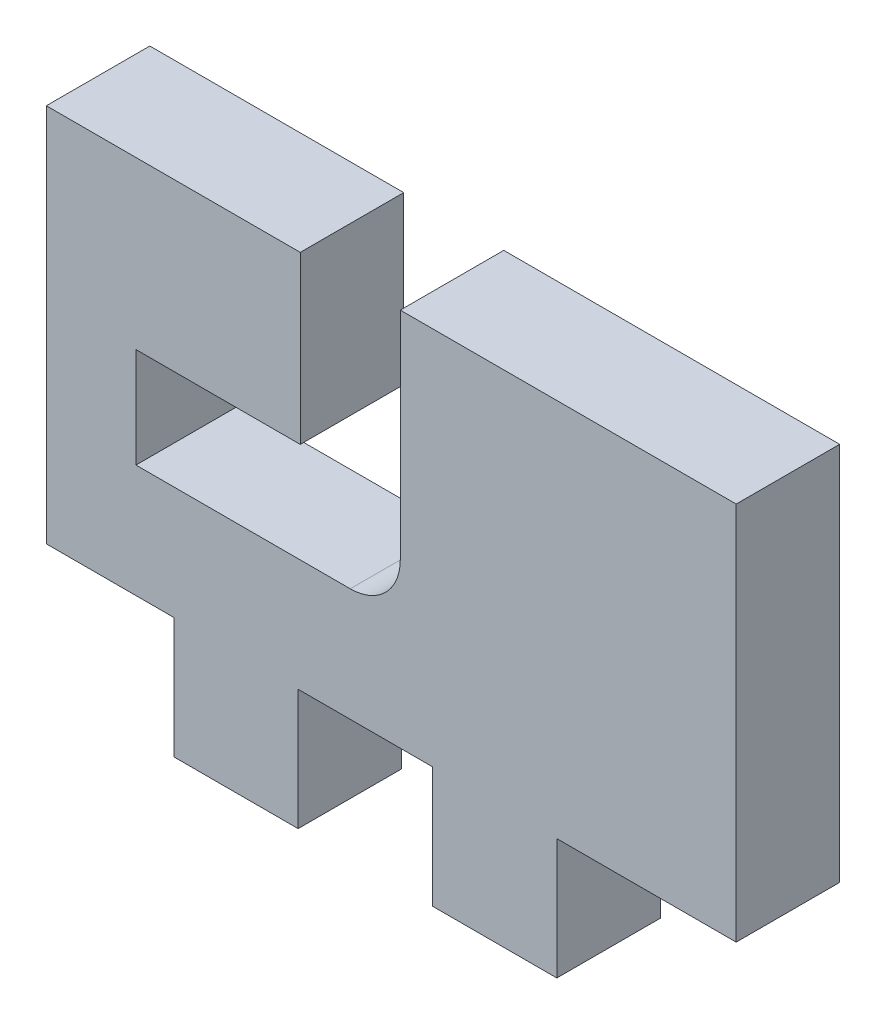
ISO-10303-21;
HEADER;
FILE_DESCRIPTION(('STEP AP214'),'2;1');
FILE_NAME('part.step','',(''),(''),'','','');
FILE_SCHEMA(('AUTOMOTIVE_DESIGN { 1 0 10303 214 1 1 1 1 }'));
ENDSEC;
DATA;
#1=APPLICATION_CONTEXT('core data for automotive mechanical design processes');
#2=APPLICATION_PROTOCOL_DEFINITION('international standard','automotive_design',2000,#1);
#3=PRODUCT_CONTEXT('',#1,'mechanical');
#4=PRODUCT('Part','Part','',(#3));
#5=PRODUCT_RELATED_PRODUCT_CATEGORY('part','',(#4));
#6=PRODUCT_DEFINITION_FORMATION('','',#4);
#7=PRODUCT_DEFINITION_CONTEXT('part definition',#1,'design');
#8=PRODUCT_DEFINITION('design','',#6,#7);
#9=PRODUCT_DEFINITION_SHAPE('','',#8);
#10=(LENGTH_UNIT() NAMED_UNIT(*) SI_UNIT(.MILLI.,.METRE.));
#11=(NAMED_UNIT(*) PLANE_ANGLE_UNIT() SI_UNIT($,.RADIAN.));
#12=(NAMED_UNIT(*) SI_UNIT($,.STERADIAN.) SOLID_ANGLE_UNIT());
#13=UNCERTAINTY_MEASURE_WITH_UNIT(LENGTH_MEASURE(1.E-05),#10,'distance_accuracy_value','');
#14=(GEOMETRIC_REPRESENTATION_CONTEXT(3) GLOBAL_UNCERTAINTY_ASSIGNED_CONTEXT((#13)) GLOBAL_UNIT_ASSIGNED_CONTEXT((#10,
#11,#12)) REPRESENTATION_CONTEXT('',''));
#15=CARTESIAN_POINT('',(0.,0.,0.));
#16=DIRECTION('',(0.,0.,1.));
#17=DIRECTION('',(1.,0.,0.));
#18=AXIS2_PLACEMENT_3D('',#15,#16,#17);
#19=CARTESIAN_POINT('',(0.927974825237484,-1.93817914495574,0.));
#20=DIRECTION('',(0.,0.,1.));
#21=DIRECTION('',(1.,0.,0.));
#22=AXIS2_PLACEMENT_3D('',#19,#20,#21);
#23=CYLINDRICAL_SURFACE('',#22,1.45);
#24=DIRECTION('',(0.,0.,1.));
#25=VECTOR('',#24,1.);
#26=CARTESIAN_POINT('',(0.927974825237484,-3.38817914495575,0.));
#27=LINE('',#26,#25);
#28=CARTESIAN_POINT('',(0.927974825237484,-3.38817914495575,3.));
#29=VERTEX_POINT('',#28);
#30=CARTESIAN_POINT('',(0.927974825237484,-3.38817914495575,0.));
#31=VERTEX_POINT('',#30);
#32=EDGE_CURVE('E47',#29,#31,#27,.F.);
#33=ORIENTED_EDGE('',*,*,#32,.F.);
#34=CARTESIAN_POINT('',(0.927974825237484,-1.93817914495574,3.));
#35=DIRECTION('',(0.,0.,1.));
#36=DIRECTION('',(1.,0.,0.));
#37=AXIS2_PLACEMENT_3D('',#34,#35,#36);
#38=CIRCLE('',#37,1.45);
#39=CARTESIAN_POINT('',(2.37797482523748,-1.93817914495574,3.));
#40=VERTEX_POINT('',#39);
#41=EDGE_CURVE('E210',#29,#40,#38,.T.);
#42=ORIENTED_EDGE('',*,*,#41,.T.);
#43=DIRECTION('',(0.,0.,1.));
#44=VECTOR('',#43,1.);
#45=CARTESIAN_POINT('',(2.37797482523748,-1.93817914495574,0.));
#46=LINE('',#45,#44);
#47=CARTESIAN_POINT('',(2.37797482523748,-1.93817914495574,0.));
#48=VERTEX_POINT('',#47);
#49=EDGE_CURVE('E217',#48,#40,#46,.T.);
#50=ORIENTED_EDGE('',*,*,#49,.F.);
#51=CARTESIAN_POINT('',(0.927974825237484,-1.93817914495574,0.));
#52=DIRECTION('',(0.,0.,1.));
#53=DIRECTION('',(1.,0.,0.));
#54=AXIS2_PLACEMENT_3D('',#51,#52,#53);
#55=CIRCLE('',#54,1.45);
#56=EDGE_CURVE('E202',#31,#48,#55,.T.);
#57=ORIENTED_EDGE('',*,*,#56,.F.);
#58=EDGE_LOOP('',(#33,#42,#50,#57));
#59=FACE_BOUND('',#58,.T.);
#60=ADVANCED_FACE('F39',(#59),#23,.F.);
#61=CARTESIAN_POINT('',(-7.8838174273859,4.33402489626557,3.));
#62=DIRECTION('',(0.,-1.,0.));
#63=DIRECTION('',(0.,0.,-1.));
#64=AXIS2_PLACEMENT_3D('',#61,#62,#63);
#65=PLANE('',#64);
#66=DIRECTION('',(-1.,0.,0.));
#67=VECTOR('',#66,1.);
#68=CARTESIAN_POINT('',(-7.8838174273859,4.33402489626557,0.));
#69=LINE('',#68,#67);
#70=CARTESIAN_POINT('',(12.1161825726141,4.33402489626557,0.));
#71=VERTEX_POINT('',#70);
#72=CARTESIAN_POINT('',(2.37797482523748,4.33402489626557,0.));
#73=VERTEX_POINT('',#72);
#74=EDGE_CURVE('E285',#71,#73,#69,.T.);
#75=ORIENTED_EDGE('',*,*,#74,.T.);
#76=DIRECTION('',(0.,0.,1.));
#77=VECTOR('',#76,1.);
#78=CARTESIAN_POINT('',(2.37797482523748,4.33402489626557,0.));
#79=LINE('',#78,#77);
#80=CARTESIAN_POINT('',(2.37797482523748,4.33402489626557,3.));
#81=VERTEX_POINT('',#80);
#82=EDGE_CURVE('E213',#73,#81,#79,.T.);
#83=ORIENTED_EDGE('',*,*,#82,.T.);
#84=DIRECTION('',(-1.,0.,0.));
#85=VECTOR('',#84,1.);
#86=CARTESIAN_POINT('',(-7.8838174273859,4.33402489626557,3.));
#87=LINE('',#86,#85);
#88=CARTESIAN_POINT('',(12.1161825726141,4.33402489626557,3.));
#89=VERTEX_POINT('',#88);
#90=EDGE_CURVE('E292',#89,#81,#87,.T.);
#91=ORIENTED_EDGE('',*,*,#90,.F.);
#92=DIRECTION('',(0.,0.,-1.));
#93=VECTOR('',#92,1.);
#94=CARTESIAN_POINT('',(12.1161825726141,4.33402489626557,3.));
#95=LINE('',#94,#93);
#96=EDGE_CURVE('E309',#89,#71,#95,.T.);
#97=ORIENTED_EDGE('',*,*,#96,.T.);
#98=EDGE_LOOP('',(#75,#83,#91,#97));
#99=FACE_BOUND('',#98,.T.);
#100=ADVANCED_FACE('F327',(#99),#65,.F.);
#101=CARTESIAN_POINT('',(-7.8838174273859,-10.1659751037344,3.));
#102=DIRECTION('',(0.,1.,0.));
#103=DIRECTION('',(0.,0.,1.));
#104=AXIS2_PLACEMENT_3D('',#101,#102,#103);
#105=PLANE('',#104);
#106=DIRECTION('',(1.,0.,0.));
#107=VECTOR('',#106,1.);
#108=CARTESIAN_POINT('',(-7.8838174273859,-10.1659751037344,3.));
#109=LINE('',#108,#107);
#110=CARTESIAN_POINT('',(-4.1838174273859,-10.1659751037344,3.));
#111=VERTEX_POINT('',#110);
#112=CARTESIAN_POINT('',(-0.583817427385895,-10.1659751037344,3.));
#113=VERTEX_POINT('',#112);
#114=EDGE_CURVE('E288',#111,#113,#109,.T.);
#115=ORIENTED_EDGE('',*,*,#114,.F.);
#116=DIRECTION('',(0.,0.,1.));
#117=VECTOR('',#116,1.);
#118=CARTESIAN_POINT('',(-4.1838174273859,-10.1659751037344,0.));
#119=LINE('',#118,#117);
#120=CARTESIAN_POINT('',(-4.1838174273859,-10.1659751037344,0.));
#121=VERTEX_POINT('',#120);
#122=EDGE_CURVE('E226',#121,#111,#119,.T.);
#123=ORIENTED_EDGE('',*,*,#122,.F.);
#124=DIRECTION('',(1.,0.,0.));
#125=VECTOR('',#124,1.);
#126=CARTESIAN_POINT('',(-7.8838174273859,-10.1659751037344,0.));
#127=LINE('',#126,#125);
#128=CARTESIAN_POINT('',(-0.583817427385895,-10.1659751037344,0.));
#129=VERTEX_POINT('',#128);
#130=EDGE_CURVE('E301',#121,#129,#127,.T.);
#131=ORIENTED_EDGE('',*,*,#130,.T.);
#132=DIRECTION('',(0.,0.,1.));
#133=VECTOR('',#132,1.);
#134=CARTESIAN_POINT('',(-0.583817427385895,-10.1659751037344,0.));
#135=LINE('',#134,#133);
#136=EDGE_CURVE('E239',#129,#113,#135,.T.);
#137=ORIENTED_EDGE('',*,*,#136,.T.);
#138=EDGE_LOOP('',(#115,#123,#131,#137));
#139=FACE_BOUND('',#138,.T.);
#140=ADVANCED_FACE('F362',(#139),#105,.F.);
#141=CARTESIAN_POINT('',(-7.8838174273859,4.33402489626557,3.));
#142=DIRECTION('',(1.,0.,0.));
#143=DIRECTION('',(0.,1.,0.));
#144=AXIS2_PLACEMENT_3D('',#141,#142,#143);
#145=PLANE('',#144);
#146=DIRECTION('',(0.,-1.,0.));
#147=VECTOR('',#146,1.);
#148=CARTESIAN_POINT('',(-7.8838174273859,4.33402489626557,0.));
#149=LINE('',#148,#147);
#150=CARTESIAN_POINT('',(-7.8838174273859,4.33402489626557,0.));
#151=VERTEX_POINT('',#150);
#152=CARTESIAN_POINT('',(-7.8838174273859,-6.66597510373444,0.));
#153=VERTEX_POINT('',#152);
#154=EDGE_CURVE('E235',#151,#153,#149,.T.);
#155=ORIENTED_EDGE('',*,*,#154,.T.);
#156=DIRECTION('',(0.,0.,1.));
#157=VECTOR('',#156,1.);
#158=CARTESIAN_POINT('',(-7.8838174273859,-6.66597510373444,0.));
#159=LINE('',#158,#157);
#160=CARTESIAN_POINT('',(-7.8838174273859,-6.66597510373444,3.));
#161=VERTEX_POINT('',#160);
#162=EDGE_CURVE('E232',#153,#161,#159,.T.);
#163=ORIENTED_EDGE('',*,*,#162,.T.);
#164=DIRECTION('',(0.,-1.,0.));
#165=VECTOR('',#164,1.);
#166=CARTESIAN_POINT('',(-7.8838174273859,4.33402489626557,3.));
#167=LINE('',#166,#165);
#168=CARTESIAN_POINT('',(-7.8838174273859,4.33402489626557,3.));
#169=VERTEX_POINT('',#168);
#170=EDGE_CURVE('E281',#169,#161,#167,.T.);
#171=ORIENTED_EDGE('',*,*,#170,.F.);
#172=DIRECTION('',(0.,0.,-1.));
#173=VECTOR('',#172,1.);
#174=CARTESIAN_POINT('',(-7.8838174273859,4.33402489626557,3.));
#175=LINE('',#174,#173);
#176=EDGE_CURVE('E295',#169,#151,#175,.T.);
#177=ORIENTED_EDGE('',*,*,#176,.T.);
#178=EDGE_LOOP('',(#155,#163,#171,#177));
#179=FACE_BOUND('',#178,.T.);
#180=ADVANCED_FACE('F41',(#179),#145,.F.);
#181=CARTESIAN_POINT('',(3.3161825726141,-10.1659751037344,3.));
#182=VERTEX_POINT('',#181);
#183=CARTESIAN_POINT('',(6.9161825726141,-10.1659751037344,3.));
#184=VERTEX_POINT('',#183);
#185=EDGE_CURVE('E284',#182,#184,#109,.T.);
#186=ORIENTED_EDGE('',*,*,#185,.F.);
#187=DIRECTION('',(0.,0.,1.));
#188=VECTOR('',#187,1.);
#189=CARTESIAN_POINT('',(3.3161825726141,-10.1659751037344,0.));
#190=LINE('',#189,#188);
#191=CARTESIAN_POINT('',(3.3161825726141,-10.1659751037344,0.));
#192=VERTEX_POINT('',#191);
#193=EDGE_CURVE('E243',#192,#182,#190,.T.);
#194=ORIENTED_EDGE('',*,*,#193,.F.);
#195=CARTESIAN_POINT('',(6.9161825726141,-10.1659751037344,0.));
#196=VERTEX_POINT('',#195);
#197=EDGE_CURVE('E298',#192,#196,#127,.T.);
#198=ORIENTED_EDGE('',*,*,#197,.T.);
#199=DIRECTION('',(0.,0.,1.));
#200=VECTOR('',#199,1.);
#201=CARTESIAN_POINT('',(6.9161825726141,-10.1659751037344,0.));
#202=LINE('',#201,#200);
#203=EDGE_CURVE('E265',#196,#184,#202,.T.);
#204=ORIENTED_EDGE('',*,*,#203,.T.);
#205=EDGE_LOOP('',(#186,#194,#198,#204));
#206=FACE_BOUND('',#205,.T.);
#207=ADVANCED_FACE('F344',(#206),#105,.F.);
#208=CARTESIAN_POINT('',(12.1161825726141,4.33402489626557,3.));
#209=DIRECTION('',(-1.,0.,0.));
#210=DIRECTION('',(0.,-1.,0.));
#211=AXIS2_PLACEMENT_3D('',#208,#209,#210);
#212=PLANE('',#211);
#213=DIRECTION('',(0.,1.,0.));
#214=VECTOR('',#213,1.);
#215=CARTESIAN_POINT('',(12.1161825726141,4.33402489626557,3.));
#216=LINE('',#215,#214);
#217=CARTESIAN_POINT('',(12.1161825726141,-6.66597510373444,3.));
#218=VERTEX_POINT('',#217);
#219=EDGE_CURVE('E289',#218,#89,#216,.T.);
#220=ORIENTED_EDGE('',*,*,#219,.F.);
#221=DIRECTION('',(0.,0.,1.));
#222=VECTOR('',#221,1.);
#223=CARTESIAN_POINT('',(12.1161825726141,-6.66597510373444,0.));
#224=LINE('',#223,#222);
#225=CARTESIAN_POINT('',(12.1161825726141,-6.66597510373444,0.));
#226=VERTEX_POINT('',#225);
#227=EDGE_CURVE('E269',#226,#218,#224,.T.);
#228=ORIENTED_EDGE('',*,*,#227,.F.);
#229=DIRECTION('',(0.,1.,0.));
#230=VECTOR('',#229,1.);
#231=CARTESIAN_POINT('',(12.1161825726141,4.33402489626557,0.));
#232=LINE('',#231,#230);
#233=EDGE_CURVE('E302',#226,#71,#232,.T.);
#234=ORIENTED_EDGE('',*,*,#233,.T.);
#235=ORIENTED_EDGE('',*,*,#96,.F.);
#236=EDGE_LOOP('',(#220,#228,#234,#235));
#237=FACE_BOUND('',#236,.T.);
#238=ADVANCED_FACE('F332',(#237),#212,.F.);
#239=CARTESIAN_POINT('',(-0.522025174762518,4.33402489626557,3.));
#240=VERTEX_POINT('',#239);
#241=EDGE_CURVE('E291',#240,#169,#87,.T.);
#242=ORIENTED_EDGE('',*,*,#241,.F.);
#243=DIRECTION('',(0.,0.,1.));
#244=VECTOR('',#243,1.);
#245=CARTESIAN_POINT('',(-0.522025174762518,4.33402489626557,0.));
#246=LINE('',#245,#244);
#247=CARTESIAN_POINT('',(-0.522025174762518,4.33402489626557,0.));
#248=VERTEX_POINT('',#247);
#249=EDGE_CURVE('E208',#248,#240,#246,.T.);
#250=ORIENTED_EDGE('',*,*,#249,.F.);
#251=EDGE_CURVE('E304',#248,#151,#69,.T.);
#252=ORIENTED_EDGE('',*,*,#251,.T.);
#253=ORIENTED_EDGE('',*,*,#176,.F.);
#254=EDGE_LOOP('',(#242,#250,#252,#253));
#255=FACE_BOUND('',#254,.T.);
#256=ADVANCED_FACE('F375',(#255),#65,.F.);
#257=CARTESIAN_POINT('',(0.,0.,3.));
#258=DIRECTION('',(0.,0.,1.));
#259=DIRECTION('',(1.,0.,0.));
#260=AXIS2_PLACEMENT_3D('',#257,#258,#259);
#261=PLANE('',#260);
#262=DIRECTION('',(1.,0.,0.));
#263=VECTOR('',#262,1.);
#264=CARTESIAN_POINT('',(0.927974825237484,-3.38817914495575,3.));
#265=LINE('',#264,#263);
#266=CARTESIAN_POINT('',(-5.28536152041942,-3.38817914495575,3.));
#267=VERTEX_POINT('',#266);
#268=EDGE_CURVE('E178',#267,#29,#265,.T.);
#269=ORIENTED_EDGE('',*,*,#268,.F.);
#270=DIRECTION('',(0.,-1.,0.));
#271=VECTOR('',#270,1.);
#272=CARTESIAN_POINT('',(-5.28536152041942,-3.38817914495575,3.));
#273=LINE('',#272,#271);
#274=CARTESIAN_POINT('',(-5.28536152041942,-0.488179144955746,3.));
#275=VERTEX_POINT('',#274);
#276=EDGE_CURVE('E175',#275,#267,#273,.T.);
#277=ORIENTED_EDGE('',*,*,#276,.F.);
#278=DIRECTION('',(-1.,0.,0.));
#279=VECTOR('',#278,1.);
#280=CARTESIAN_POINT('',(0.927974825237484,-0.488179144955745,3.));
#281=LINE('',#280,#279);
#282=CARTESIAN_POINT('',(-0.522025174762517,-0.488179144955745,3.));
#283=VERTEX_POINT('',#282);
#284=EDGE_CURVE('E181',#283,#275,#281,.T.);
#285=ORIENTED_EDGE('',*,*,#284,.F.);
#286=DIRECTION('',(0.,-1.,0.));
#287=VECTOR('',#286,1.);
#288=CARTESIAN_POINT('',(-0.522025174762518,4.33402489626557,3.));
#289=LINE('',#288,#287);
#290=EDGE_CURVE('E198',#240,#283,#289,.T.);
#291=ORIENTED_EDGE('',*,*,#290,.F.);
#292=ORIENTED_EDGE('',*,*,#241,.T.);
#293=ORIENTED_EDGE('',*,*,#170,.T.);
#294=DIRECTION('',(-1.,0.,0.));
#295=VECTOR('',#294,1.);
#296=CARTESIAN_POINT('',(-7.8838174273859,-6.66597510373444,3.));
#297=LINE('',#296,#295);
#298=CARTESIAN_POINT('',(-4.1838174273859,-6.66597510373444,3.));
#299=VERTEX_POINT('',#298);
#300=EDGE_CURVE('E224',#299,#161,#297,.T.);
#301=ORIENTED_EDGE('',*,*,#300,.F.);
#302=DIRECTION('',(0.,1.,0.));
#303=VECTOR('',#302,1.);
#304=CARTESIAN_POINT('',(-4.1838174273859,-10.1659751037344,3.));
#305=LINE('',#304,#303);
#306=EDGE_CURVE('E227',#111,#299,#305,.T.);
#307=ORIENTED_EDGE('',*,*,#306,.F.);
#308=ORIENTED_EDGE('',*,*,#114,.T.);
#309=DIRECTION('',(0.,-1.,0.));
#310=VECTOR('',#309,1.);
#311=CARTESIAN_POINT('',(-0.583817427385895,-10.1659751037344,3.));
#312=LINE('',#311,#310);
#313=CARTESIAN_POINT('',(-0.583817427385895,-6.66597510373444,3.));
#314=VERTEX_POINT('',#313);
#315=EDGE_CURVE('E230',#314,#113,#312,.T.);
#316=ORIENTED_EDGE('',*,*,#315,.F.);
#317=DIRECTION('',(-1.,0.,0.));
#318=VECTOR('',#317,1.);
#319=CARTESIAN_POINT('',(-0.583817427385895,-6.66597510373444,3.));
#320=LINE('',#319,#318);
#321=CARTESIAN_POINT('',(3.3161825726141,-6.66597510373444,3.));
#322=VERTEX_POINT('',#321);
#323=EDGE_CURVE('E250',#322,#314,#320,.T.);
#324=ORIENTED_EDGE('',*,*,#323,.F.);
#325=DIRECTION('',(0.,1.,0.));
#326=VECTOR('',#325,1.);
#327=CARTESIAN_POINT('',(3.3161825726141,-10.1659751037344,3.));
#328=LINE('',#327,#326);
#329=EDGE_CURVE('E253',#182,#322,#328,.T.);
#330=ORIENTED_EDGE('',*,*,#329,.F.);
#331=ORIENTED_EDGE('',*,*,#185,.T.);
#332=DIRECTION('',(0.,-1.,0.));
#333=VECTOR('',#332,1.);
#334=CARTESIAN_POINT('',(6.9161825726141,-10.1659751037344,3.));
#335=LINE('',#334,#333);
#336=CARTESIAN_POINT('',(6.9161825726141,-6.66597510373444,3.));
#337=VERTEX_POINT('',#336);
#338=EDGE_CURVE('E249',#337,#184,#335,.T.);
#339=ORIENTED_EDGE('',*,*,#338,.F.);
#340=DIRECTION('',(-1.,0.,0.));
#341=VECTOR('',#340,1.);
#342=CARTESIAN_POINT('',(6.9161825726141,-6.66597510373444,3.));
#343=LINE('',#342,#341);
#344=EDGE_CURVE('E272',#218,#337,#343,.T.);
#345=ORIENTED_EDGE('',*,*,#344,.F.);
#346=ORIENTED_EDGE('',*,*,#219,.T.);
#347=ORIENTED_EDGE('',*,*,#90,.T.);
#348=DIRECTION('',(0.,1.,0.));
#349=VECTOR('',#348,1.);
#350=CARTESIAN_POINT('',(2.37797482523748,4.33402489626557,3.));
#351=LINE('',#350,#349);
#352=EDGE_CURVE('E203',#40,#81,#351,.T.);
#353=ORIENTED_EDGE('',*,*,#352,.F.);
#354=ORIENTED_EDGE('',*,*,#41,.F.);
#355=EDGE_LOOP('',(#269,#277,#285,#291,#292,#293,#301,#307,#308,#316,#324,#330,#331,#339,#345,
#346,#347,#353,#354));
#356=FACE_BOUND('',#355,.T.);
#357=ADVANCED_FACE('F188',(#356),#261,.T.);
#358=CARTESIAN_POINT('',(0.,0.,0.));
#359=DIRECTION('',(0.,0.,1.));
#360=DIRECTION('',(1.,0.,0.));
#361=AXIS2_PLACEMENT_3D('',#358,#359,#360);
#362=PLANE('',#361);
#363=DIRECTION('',(0.,-1.,0.));
#364=VECTOR('',#363,1.);
#365=CARTESIAN_POINT('',(-5.28536152041942,0.,0.));
#366=LINE('',#365,#364);
#367=CARTESIAN_POINT('',(-5.28536152041942,-0.488179144955746,0.));
#368=VERTEX_POINT('',#367);
#369=CARTESIAN_POINT('',(-5.28536152041942,-3.38817914495575,0.));
#370=VERTEX_POINT('',#369);
#371=EDGE_CURVE('E11',#368,#370,#366,.T.);
#372=ORIENTED_EDGE('',*,*,#371,.T.);
#373=DIRECTION('',(1.,0.,0.));
#374=VECTOR('',#373,1.);
#375=CARTESIAN_POINT('',(0.,-3.38817914495575,0.));
#376=LINE('',#375,#374);
#377=EDGE_CURVE('E195',#370,#31,#376,.T.);
#378=ORIENTED_EDGE('',*,*,#377,.T.);
#379=ORIENTED_EDGE('',*,*,#56,.T.);
#380=DIRECTION('',(0.,1.,0.));
#381=VECTOR('',#380,1.);
#382=CARTESIAN_POINT('',(2.37797482523748,4.33402489626557,0.));
#383=LINE('',#382,#381);
#384=EDGE_CURVE('E205',#48,#73,#383,.T.);
#385=ORIENTED_EDGE('',*,*,#384,.T.);
#386=ORIENTED_EDGE('',*,*,#74,.F.);
#387=ORIENTED_EDGE('',*,*,#233,.F.);
#388=DIRECTION('',(-1.,0.,0.));
#389=VECTOR('',#388,1.);
#390=CARTESIAN_POINT('',(6.9161825726141,-6.66597510373444,0.));
#391=LINE('',#390,#389);
#392=CARTESIAN_POINT('',(6.9161825726141,-6.66597510373444,0.));
#393=VERTEX_POINT('',#392);
#394=EDGE_CURVE('E268',#226,#393,#391,.T.);
#395=ORIENTED_EDGE('',*,*,#394,.T.);
#396=DIRECTION('',(0.,-1.,0.));
#397=VECTOR('',#396,1.);
#398=CARTESIAN_POINT('',(6.9161825726141,-10.1659751037344,0.));
#399=LINE('',#398,#397);
#400=EDGE_CURVE('E275',#393,#196,#399,.T.);
#401=ORIENTED_EDGE('',*,*,#400,.T.);
#402=ORIENTED_EDGE('',*,*,#197,.F.);
#403=DIRECTION('',(0.,1.,0.));
#404=VECTOR('',#403,1.);
#405=CARTESIAN_POINT('',(3.3161825726141,-10.1659751037344,0.));
#406=LINE('',#405,#404);
#407=CARTESIAN_POINT('',(3.3161825726141,-6.66597510373444,0.));
#408=VERTEX_POINT('',#407);
#409=EDGE_CURVE('E260',#192,#408,#406,.T.);
#410=ORIENTED_EDGE('',*,*,#409,.T.);
#411=DIRECTION('',(-1.,0.,0.));
#412=VECTOR('',#411,1.);
#413=CARTESIAN_POINT('',(-0.583817427385895,-6.66597510373444,0.));
#414=LINE('',#413,#412);
#415=CARTESIAN_POINT('',(-0.583817427385895,-6.66597510373444,0.));
#416=VERTEX_POINT('',#415);
#417=EDGE_CURVE('E242',#408,#416,#414,.T.);
#418=ORIENTED_EDGE('',*,*,#417,.T.);
#419=DIRECTION('',(0.,-1.,0.));
#420=VECTOR('',#419,1.);
#421=CARTESIAN_POINT('',(-0.583817427385895,-10.1659751037344,0.));
#422=LINE('',#421,#420);
#423=EDGE_CURVE('E254',#416,#129,#422,.T.);
#424=ORIENTED_EDGE('',*,*,#423,.T.);
#425=ORIENTED_EDGE('',*,*,#130,.F.);
#426=DIRECTION('',(0.,1.,0.));
#427=VECTOR('',#426,1.);
#428=CARTESIAN_POINT('',(-4.1838174273859,-10.1659751037344,0.));
#429=LINE('',#428,#427);
#430=CARTESIAN_POINT('',(-4.1838174273859,-6.66597510373444,0.));
#431=VERTEX_POINT('',#430);
#432=EDGE_CURVE('E221',#121,#431,#429,.T.);
#433=ORIENTED_EDGE('',*,*,#432,.T.);
#434=DIRECTION('',(-1.,0.,0.));
#435=VECTOR('',#434,1.);
#436=CARTESIAN_POINT('',(-7.8838174273859,-6.66597510373444,0.));
#437=LINE('',#436,#435);
#438=EDGE_CURVE('E62',#431,#153,#437,.T.);
#439=ORIENTED_EDGE('',*,*,#438,.T.);
#440=ORIENTED_EDGE('',*,*,#154,.F.);
#441=ORIENTED_EDGE('',*,*,#251,.F.);
#442=DIRECTION('',(0.,-1.,0.));
#443=VECTOR('',#442,1.);
#444=CARTESIAN_POINT('',(-0.522025174762518,4.33402489626557,0.));
#445=LINE('',#444,#443);
#446=CARTESIAN_POINT('',(-0.522025174762517,-0.488179144955745,0.));
#447=VERTEX_POINT('',#446);
#448=EDGE_CURVE('E199',#248,#447,#445,.T.);
#449=ORIENTED_EDGE('',*,*,#448,.T.);
#450=DIRECTION('',(-1.,0.,0.));
#451=VECTOR('',#450,1.);
#452=CARTESIAN_POINT('',(0.,-0.488179144955745,0.));
#453=LINE('',#452,#451);
#454=EDGE_CURVE('E54',#447,#368,#453,.T.);
#455=ORIENTED_EDGE('',*,*,#454,.T.);
#456=EDGE_LOOP('',(#372,#378,#379,#385,#386,#387,#395,#401,#402,#410,#418,#424,#425,#433,#439,
#440,#441,#449,#455));
#457=FACE_BOUND('',#456,.T.);
#458=ADVANCED_FACE('F318',(#457),#362,.F.);
#459=CARTESIAN_POINT('',(6.9161825726141,-10.1659751037344,0.));
#460=DIRECTION('',(-1.,0.,0.));
#461=DIRECTION('',(0.,0.,1.));
#462=AXIS2_PLACEMENT_3D('',#459,#460,#461);
#463=PLANE('',#462);
#464=ORIENTED_EDGE('',*,*,#338,.T.);
#465=ORIENTED_EDGE('',*,*,#203,.F.);
#466=ORIENTED_EDGE('',*,*,#400,.F.);
#467=DIRECTION('',(0.,0.,1.));
#468=VECTOR('',#467,1.);
#469=CARTESIAN_POINT('',(6.9161825726141,-6.66597510373444,0.));
#470=LINE('',#469,#468);
#471=EDGE_CURVE('E216',#393,#337,#470,.T.);
#472=ORIENTED_EDGE('',*,*,#471,.T.);
#473=EDGE_LOOP('',(#464,#465,#466,#472));
#474=FACE_BOUND('',#473,.T.);
#475=ADVANCED_FACE('F341',(#474),#463,.F.);
#476=CARTESIAN_POINT('',(6.9161825726141,-6.66597510373444,0.));
#477=DIRECTION('',(0.,1.,0.));
#478=DIRECTION('',(0.,0.,1.));
#479=AXIS2_PLACEMENT_3D('',#476,#477,#478);
#480=PLANE('',#479);
#481=ORIENTED_EDGE('',*,*,#344,.T.);
#482=ORIENTED_EDGE('',*,*,#471,.F.);
#483=ORIENTED_EDGE('',*,*,#394,.F.);
#484=ORIENTED_EDGE('',*,*,#227,.T.);
#485=EDGE_LOOP('',(#481,#482,#483,#484));
#486=FACE_BOUND('',#485,.T.);
#487=ADVANCED_FACE('F337',(#486),#480,.F.);
#488=CARTESIAN_POINT('',(-0.583817427385895,-10.1659751037344,0.));
#489=DIRECTION('',(-1.,0.,0.));
#490=DIRECTION('',(0.,0.,1.));
#491=AXIS2_PLACEMENT_3D('',#488,#489,#490);
#492=PLANE('',#491);
#493=ORIENTED_EDGE('',*,*,#315,.T.);
#494=ORIENTED_EDGE('',*,*,#136,.F.);
#495=ORIENTED_EDGE('',*,*,#423,.F.);
#496=DIRECTION('',(0.,0.,1.));
#497=VECTOR('',#496,1.);
#498=CARTESIAN_POINT('',(-0.583817427385895,-6.66597510373444,0.));
#499=LINE('',#498,#497);
#500=EDGE_CURVE('E247',#416,#314,#499,.T.);
#501=ORIENTED_EDGE('',*,*,#500,.T.);
#502=EDGE_LOOP('',(#493,#494,#495,#501));
#503=FACE_BOUND('',#502,.T.);
#504=ADVANCED_FACE('F358',(#503),#492,.F.);
#505=CARTESIAN_POINT('',(-0.583817427385895,-6.66597510373444,0.));
#506=DIRECTION('',(0.,1.,0.));
#507=DIRECTION('',(0.,0.,1.));
#508=AXIS2_PLACEMENT_3D('',#505,#506,#507);
#509=PLANE('',#508);
#510=ORIENTED_EDGE('',*,*,#323,.T.);
#511=ORIENTED_EDGE('',*,*,#500,.F.);
#512=ORIENTED_EDGE('',*,*,#417,.F.);
#513=DIRECTION('',(0.,0.,1.));
#514=VECTOR('',#513,1.);
#515=CARTESIAN_POINT('',(3.3161825726141,-6.66597510373444,0.));
#516=LINE('',#515,#514);
#517=EDGE_CURVE('E245',#408,#322,#516,.T.);
#518=ORIENTED_EDGE('',*,*,#517,.T.);
#519=EDGE_LOOP('',(#510,#511,#512,#518));
#520=FACE_BOUND('',#519,.T.);
#521=ADVANCED_FACE('F356',(#520),#509,.F.);
#522=CARTESIAN_POINT('',(3.3161825726141,-10.1659751037344,0.));
#523=DIRECTION('',(1.,0.,0.));
#524=DIRECTION('',(0.,0.,-1.));
#525=AXIS2_PLACEMENT_3D('',#522,#523,#524);
#526=PLANE('',#525);
#527=ORIENTED_EDGE('',*,*,#329,.T.);
#528=ORIENTED_EDGE('',*,*,#517,.F.);
#529=ORIENTED_EDGE('',*,*,#409,.F.);
#530=ORIENTED_EDGE('',*,*,#193,.T.);
#531=EDGE_LOOP('',(#527,#528,#529,#530));
#532=FACE_BOUND('',#531,.T.);
#533=ADVANCED_FACE('F351',(#532),#526,.F.);
#534=CARTESIAN_POINT('',(-7.8838174273859,-6.66597510373444,0.));
#535=DIRECTION('',(0.,1.,0.));
#536=DIRECTION('',(0.,0.,1.));
#537=AXIS2_PLACEMENT_3D('',#534,#535,#536);
#538=PLANE('',#537);
#539=ORIENTED_EDGE('',*,*,#300,.T.);
#540=ORIENTED_EDGE('',*,*,#162,.F.);
#541=ORIENTED_EDGE('',*,*,#438,.F.);
#542=DIRECTION('',(0.,0.,1.));
#543=VECTOR('',#542,1.);
#544=CARTESIAN_POINT('',(-4.1838174273859,-6.66597510373444,0.));
#545=LINE('',#544,#543);
#546=EDGE_CURVE('E236',#431,#299,#545,.T.);
#547=ORIENTED_EDGE('',*,*,#546,.T.);
#548=EDGE_LOOP('',(#539,#540,#541,#547));
#549=FACE_BOUND('',#548,.T.);
#550=ADVANCED_FACE('F455',(#549),#538,.F.);
#551=CARTESIAN_POINT('',(-4.1838174273859,-10.1659751037344,0.));
#552=DIRECTION('',(1.,0.,0.));
#553=DIRECTION('',(0.,0.,-1.));
#554=AXIS2_PLACEMENT_3D('',#551,#552,#553);
#555=PLANE('',#554);
#556=ORIENTED_EDGE('',*,*,#306,.T.);
#557=ORIENTED_EDGE('',*,*,#546,.F.);
#558=ORIENTED_EDGE('',*,*,#432,.F.);
#559=ORIENTED_EDGE('',*,*,#122,.T.);
#560=EDGE_LOOP('',(#556,#557,#558,#559));
#561=FACE_BOUND('',#560,.T.);
#562=ADVANCED_FACE('F367',(#561),#555,.F.);
#563=CARTESIAN_POINT('',(2.37797482523748,4.33402489626557,0.));
#564=DIRECTION('',(1.,0.,0.));
#565=DIRECTION('',(0.,0.,-1.));
#566=AXIS2_PLACEMENT_3D('',#563,#564,#565);
#567=PLANE('',#566);
#568=ORIENTED_EDGE('',*,*,#352,.T.);
#569=ORIENTED_EDGE('',*,*,#82,.F.);
#570=ORIENTED_EDGE('',*,*,#384,.F.);
#571=ORIENTED_EDGE('',*,*,#49,.T.);
#572=EDGE_LOOP('',(#568,#569,#570,#571));
#573=FACE_BOUND('',#572,.T.);
#574=ADVANCED_FACE('F323',(#573),#567,.F.);
#575=CARTESIAN_POINT('',(-0.522025174762518,4.33402489626557,0.));
#576=DIRECTION('',(-1.,0.,0.));
#577=DIRECTION('',(0.,-1.,0.));
#578=AXIS2_PLACEMENT_3D('',#575,#576,#577);
#579=PLANE('',#578);
#580=ORIENTED_EDGE('',*,*,#290,.T.);
#581=DIRECTION('',(0.,0.,-1.));
#582=VECTOR('',#581,1.);
#583=CARTESIAN_POINT('',(-0.522025174762517,-0.488179144955745,0.));
#584=LINE('',#583,#582);
#585=EDGE_CURVE('E183',#283,#447,#584,.T.);
#586=ORIENTED_EDGE('',*,*,#585,.T.);
#587=ORIENTED_EDGE('',*,*,#448,.F.);
#588=ORIENTED_EDGE('',*,*,#249,.T.);
#589=EDGE_LOOP('',(#580,#586,#587,#588));
#590=FACE_BOUND('',#589,.T.);
#591=ADVANCED_FACE('F378',(#590),#579,.F.);
#592=CARTESIAN_POINT('',(-5.28536152041942,-3.38817914495575,-7.));
#593=DIRECTION('',(-1.,0.,0.));
#594=DIRECTION('',(0.,0.,1.));
#595=AXIS2_PLACEMENT_3D('',#592,#593,#594);
#596=PLANE('',#595);
#597=DIRECTION('',(0.,0.,1.));
#598=VECTOR('',#597,1.);
#599=CARTESIAN_POINT('',(-5.28536152041942,-0.488179144955746,-7.));
#600=LINE('',#599,#598);
#601=EDGE_CURVE('E170',#368,#275,#600,.T.);
#602=ORIENTED_EDGE('',*,*,#601,.T.);
#603=ORIENTED_EDGE('',*,*,#276,.T.);
#604=DIRECTION('',(0.,0.,1.));
#605=VECTOR('',#604,1.);
#606=CARTESIAN_POINT('',(-5.28536152041942,-3.38817914495575,-7.));
#607=LINE('',#606,#605);
#608=EDGE_CURVE('E177',#370,#267,#607,.T.);
#609=ORIENTED_EDGE('',*,*,#608,.F.);
#610=ORIENTED_EDGE('',*,*,#371,.F.);
#611=EDGE_LOOP('',(#602,#603,#609,#610));
#612=FACE_BOUND('',#611,.T.);
#613=ADVANCED_FACE('F172',(#612),#596,.F.);
#614=CARTESIAN_POINT('',(0.927974825237484,-3.38817914495575,-7.));
#615=DIRECTION('',(0.,-1.,0.));
#616=DIRECTION('',(0.,0.,-1.));
#617=AXIS2_PLACEMENT_3D('',#614,#615,#616);
#618=PLANE('',#617);
#619=ORIENTED_EDGE('',*,*,#608,.T.);
#620=ORIENTED_EDGE('',*,*,#268,.T.);
#621=ORIENTED_EDGE('',*,*,#32,.T.);
#622=ORIENTED_EDGE('',*,*,#377,.F.);
#623=EDGE_LOOP('',(#619,#620,#621,#622));
#624=FACE_BOUND('',#623,.T.);
#625=ADVANCED_FACE('F314',(#624),#618,.F.);
#626=CARTESIAN_POINT('',(0.927974825237484,-0.488179144955745,-7.));
#627=DIRECTION('',(0.,1.,0.));
#628=DIRECTION('',(-1.,0.,0.));
#629=AXIS2_PLACEMENT_3D('',#626,#627,#628);
#630=PLANE('',#629);
#631=ORIENTED_EDGE('',*,*,#585,.F.);
#632=ORIENTED_EDGE('',*,*,#284,.T.);
#633=ORIENTED_EDGE('',*,*,#601,.F.);
#634=ORIENTED_EDGE('',*,*,#454,.F.);
#635=EDGE_LOOP('',(#631,#632,#633,#634));
#636=FACE_BOUND('',#635,.T.);
#637=ADVANCED_FACE('F182',(#636),#630,.F.);
#638=CLOSED_SHELL('',(#60,#100,#140,#180,#207,#238,#256,#357,#458,#475,#487,#504,#521,#533,#550,
#562,#574,#591,#613,#625,#637));
#639=MANIFOLD_SOLID_BREP('B2',#638);
#640=ADVANCED_BREP_SHAPE_REPRESENTATION('',(#18,#639),#14);
#641=SHAPE_DEFINITION_REPRESENTATION(#9,#640);
ENDSEC;
END-ISO-10303-21;
